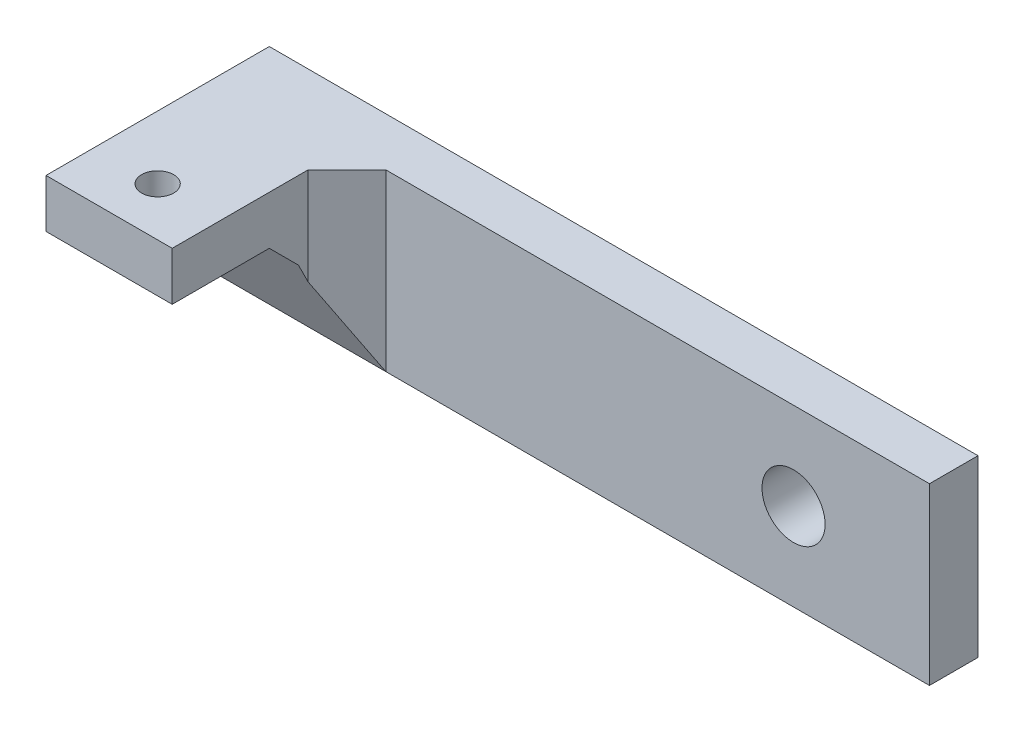
ISO-10303-21;
HEADER;
FILE_DESCRIPTION(('STEP AP214'),'2;1');
FILE_NAME('part.step','',(''),(''),'','','');
FILE_SCHEMA(('AUTOMOTIVE_DESIGN { 1 0 10303 214 1 1 1 1 }'));
ENDSEC;
DATA;
#1=APPLICATION_CONTEXT('core data for automotive mechanical design processes');
#2=APPLICATION_PROTOCOL_DEFINITION('international standard','automotive_design',2000,#1);
#3=PRODUCT_CONTEXT('',#1,'mechanical');
#4=PRODUCT('Part','Part','',(#3));
#5=PRODUCT_RELATED_PRODUCT_CATEGORY('part','',(#4));
#6=PRODUCT_DEFINITION_FORMATION('','',#4);
#7=PRODUCT_DEFINITION_CONTEXT('part definition',#1,'design');
#8=PRODUCT_DEFINITION('design','',#6,#7);
#9=PRODUCT_DEFINITION_SHAPE('','',#8);
#10=(LENGTH_UNIT() NAMED_UNIT(*) SI_UNIT(.MILLI.,.METRE.));
#11=(NAMED_UNIT(*) PLANE_ANGLE_UNIT() SI_UNIT($,.RADIAN.));
#12=(NAMED_UNIT(*) SI_UNIT($,.STERADIAN.) SOLID_ANGLE_UNIT());
#13=UNCERTAINTY_MEASURE_WITH_UNIT(LENGTH_MEASURE(1.E-05),#10,'distance_accuracy_value','');
#14=(GEOMETRIC_REPRESENTATION_CONTEXT(3) GLOBAL_UNCERTAINTY_ASSIGNED_CONTEXT((#13)) GLOBAL_UNIT_ASSIGNED_CONTEXT((#10,
#11,#12)) REPRESENTATION_CONTEXT('',''));
#15=CARTESIAN_POINT('',(0.,0.,0.));
#16=DIRECTION('',(0.,0.,1.));
#17=DIRECTION('',(1.,0.,0.));
#18=AXIS2_PLACEMENT_3D('',#15,#16,#17);
#19=CARTESIAN_POINT('',(0.,1.84930437196819,5.));
#20=DIRECTION('',(0.,1.,0.));
#21=DIRECTION('',(0.,0.,1.));
#22=AXIS2_PLACEMENT_3D('',#19,#20,#21);
#23=PLANE('',#22);
#24=DIRECTION('',(0.,0.,-1.));
#25=VECTOR('',#24,1.);
#26=CARTESIAN_POINT('',(-73.,1.84930437196819,27.2036033111745));
#27=LINE('',#26,#25);
#28=CARTESIAN_POINT('',(-73.,1.84930437196819,10.));
#29=VERTEX_POINT('',#28);
#30=CARTESIAN_POINT('',(-73.,1.8493043719682,5.));
#31=VERTEX_POINT('',#30);
#32=EDGE_CURVE('E123',#29,#31,#27,.T.);
#33=ORIENTED_EDGE('',*,*,#32,.T.);
#34=DIRECTION('',(1.,0.,0.));
#35=VECTOR('',#34,1.);
#36=CARTESIAN_POINT('',(0.,1.84930437196819,5.));
#37=LINE('',#36,#35);
#38=CARTESIAN_POINT('',(0.,1.84930437196819,5.));
#39=VERTEX_POINT('',#38);
#40=EDGE_CURVE('E108',#31,#39,#37,.T.);
#41=ORIENTED_EDGE('',*,*,#40,.T.);
#42=DIRECTION('',(0.,0.,-1.));
#43=VECTOR('',#42,1.);
#44=CARTESIAN_POINT('',(0.,1.84930437196819,5.));
#45=LINE('',#44,#43);
#46=CARTESIAN_POINT('',(0.,1.84930437196819,10.));
#47=VERTEX_POINT('',#46);
#48=EDGE_CURVE('E134',#47,#39,#45,.T.);
#49=ORIENTED_EDGE('',*,*,#48,.F.);
#50=DIRECTION('',(1.,0.,0.));
#51=VECTOR('',#50,1.);
#52=CARTESIAN_POINT('',(0.,1.84930437196819,10.));
#53=LINE('',#52,#51);
#54=CARTESIAN_POINT('',(-56.,1.84930437196819,10.));
#55=VERTEX_POINT('',#54);
#56=EDGE_CURVE('E137',#55,#47,#53,.T.);
#57=ORIENTED_EDGE('',*,*,#56,.F.);
#58=DIRECTION('',(-1.,0.,0.));
#59=VECTOR('',#58,1.);
#60=CARTESIAN_POINT('',(-50.,1.84930437196819,10.));
#61=LINE('',#60,#59);
#62=EDGE_CURVE('E131',#55,#29,#61,.T.);
#63=ORIENTED_EDGE('',*,*,#62,.T.);
#64=EDGE_LOOP('',(#33,#41,#49,#57,#63));
#65=FACE_BOUND('',#64,.T.);
#66=ADVANCED_FACE('F35',(#65),#23,.F.);
#67=CARTESIAN_POINT('',(-73.,19.8493043719682,27.2036033111745));
#68=DIRECTION('',(-1.,0.,0.));
#69=DIRECTION('',(0.,0.,1.));
#70=AXIS2_PLACEMENT_3D('',#67,#68,#69);
#71=PLANE('',#70);
#72=DIRECTION('',(0.,1.,0.));
#73=VECTOR('',#72,1.);
#74=CARTESIAN_POINT('',(-73.,19.8493043719682,5.));
#75=LINE('',#74,#73);
#76=CARTESIAN_POINT('',(-73.,19.8493043719682,5.));
#77=VERTEX_POINT('',#76);
#78=EDGE_CURVE('E51',#31,#77,#75,.T.);
#79=ORIENTED_EDGE('',*,*,#78,.F.);
#80=ORIENTED_EDGE('',*,*,#32,.F.);
#81=DIRECTION('',(0.,0.894427190999916,0.447213595499958));
#82=VECTOR('',#81,1.);
#83=CARTESIAN_POINT('',(-73.,11.8493043719682,15.));
#84=LINE('',#83,#82);
#85=CARTESIAN_POINT('',(-73.,11.8493043719682,15.));
#86=VERTEX_POINT('',#85);
#87=EDGE_CURVE('E116',#29,#86,#84,.T.);
#88=ORIENTED_EDGE('',*,*,#87,.T.);
#89=DIRECTION('',(0.,-0.707106781186543,-0.707106781186552));
#90=VECTOR('',#89,1.);
#91=CARTESIAN_POINT('',(-73.,11.8493043719682,15.));
#92=LINE('',#91,#90);
#93=CARTESIAN_POINT('',(-73.,14.8493043719682,18.));
#94=VERTEX_POINT('',#93);
#95=EDGE_CURVE('E148',#86,#94,#92,.F.);
#96=ORIENTED_EDGE('',*,*,#95,.T.);
#97=DIRECTION('',(0.,0.,-1.));
#98=VECTOR('',#97,1.);
#99=CARTESIAN_POINT('',(-73.,14.8493043719682,28.));
#100=LINE('',#99,#98);
#101=CARTESIAN_POINT('',(-73.,14.8493043719682,28.));
#102=VERTEX_POINT('',#101);
#103=EDGE_CURVE('E189',#102,#94,#100,.T.);
#104=ORIENTED_EDGE('',*,*,#103,.F.);
#105=DIRECTION('',(0.,-1.,0.));
#106=VECTOR('',#105,1.);
#107=CARTESIAN_POINT('',(-73.,19.8493043719682,28.));
#108=LINE('',#107,#106);
#109=CARTESIAN_POINT('',(-73.,19.8493043719682,28.));
#110=VERTEX_POINT('',#109);
#111=EDGE_CURVE('E181',#110,#102,#108,.T.);
#112=ORIENTED_EDGE('',*,*,#111,.F.);
#113=DIRECTION('',(0.,0.,-1.));
#114=VECTOR('',#113,1.);
#115=CARTESIAN_POINT('',(-73.,19.8493043719682,27.2036033111745));
#116=LINE('',#115,#114);
#117=EDGE_CURVE('E125',#110,#77,#116,.T.);
#118=ORIENTED_EDGE('',*,*,#117,.T.);
#119=EDGE_LOOP('',(#79,#80,#88,#96,#104,#112,#118));
#120=FACE_BOUND('',#119,.T.);
#121=ADVANCED_FACE('F121',(#120),#71,.T.);
#122=CARTESIAN_POINT('',(-60.,19.8493043719682,-17.2036033111745));
#123=DIRECTION('',(-1.,0.,0.));
#124=DIRECTION('',(0.,0.,1.));
#125=AXIS2_PLACEMENT_3D('',#122,#123,#124);
#126=PLANE('',#125);
#127=DIRECTION('',(0.,0.894427190999916,0.447213595499958));
#128=VECTOR('',#127,1.);
#129=CARTESIAN_POINT('',(-60.,5.36786304749839,11.7592793377651));
#130=LINE('',#129,#128);
#131=CARTESIAN_POINT('',(-60.,9.84930437196826,14.));
#132=VERTEX_POINT('',#131);
#133=CARTESIAN_POINT('',(-60.,11.8493043719682,15.));
#134=VERTEX_POINT('',#133);
#135=EDGE_CURVE('E173',#132,#134,#130,.T.);
#136=ORIENTED_EDGE('',*,*,#135,.F.);
#137=DIRECTION('',(0.,1.,0.));
#138=VECTOR('',#137,1.);
#139=CARTESIAN_POINT('',(-60.,19.8493043719682,14.));
#140=LINE('',#139,#138);
#141=CARTESIAN_POINT('',(-60.,19.8493043719682,14.));
#142=VERTEX_POINT('',#141);
#143=EDGE_CURVE('E59',#132,#142,#140,.T.);
#144=ORIENTED_EDGE('',*,*,#143,.T.);
#145=DIRECTION('',(0.,0.,1.));
#146=VECTOR('',#145,1.);
#147=CARTESIAN_POINT('',(-60.,19.8493043719682,-17.2036033111745));
#148=LINE('',#147,#146);
#149=CARTESIAN_POINT('',(-60.,19.8493043719682,28.));
#150=VERTEX_POINT('',#149);
#151=EDGE_CURVE('E162',#142,#150,#148,.T.);
#152=ORIENTED_EDGE('',*,*,#151,.T.);
#153=DIRECTION('',(0.,-1.,0.));
#154=VECTOR('',#153,1.);
#155=CARTESIAN_POINT('',(-60.,19.8493043719682,28.));
#156=LINE('',#155,#154);
#157=CARTESIAN_POINT('',(-60.,14.8493043719682,28.));
#158=VERTEX_POINT('',#157);
#159=EDGE_CURVE('E193',#150,#158,#156,.T.);
#160=ORIENTED_EDGE('',*,*,#159,.T.);
#161=DIRECTION('',(0.,0.,-1.));
#162=VECTOR('',#161,1.);
#163=CARTESIAN_POINT('',(-60.,14.8493043719682,28.));
#164=LINE('',#163,#162);
#165=CARTESIAN_POINT('',(-60.,14.8493043719682,18.));
#166=VERTEX_POINT('',#165);
#167=EDGE_CURVE('E192',#158,#166,#164,.T.);
#168=ORIENTED_EDGE('',*,*,#167,.T.);
#169=DIRECTION('',(0.,0.707106781186543,0.707106781186552));
#170=VECTOR('',#169,1.);
#171=CARTESIAN_POINT('',(-60.,-0.252497283619112,2.89819834441256));
#172=LINE('',#171,#170);
#173=EDGE_CURVE('E150',#166,#134,#172,.F.);
#174=ORIENTED_EDGE('',*,*,#173,.T.);
#175=EDGE_LOOP('',(#136,#144,#152,#160,#168,#174));
#176=FACE_BOUND('',#175,.T.);
#177=ADVANCED_FACE('F174',(#176),#126,.F.);
#178=CARTESIAN_POINT('',(-56.,0.,10.));
#179=DIRECTION('',(0.707106781186551,0.,0.707106781186544));
#180=DIRECTION('',(0.,1.,0.));
#181=AXIS2_PLACEMENT_3D('',#178,#179,#180);
#182=PLANE('',#181);
#183=DIRECTION('',(0.40824829046386,-0.816496580927727,-0.408248290463864));
#184=VECTOR('',#183,1.);
#185=CARTESIAN_POINT('',(-55.3835652093439,0.616434790656061,9.38356520934393));
#186=LINE('',#185,#184);
#187=EDGE_CURVE('E11',#55,#132,#186,.F.);
#188=ORIENTED_EDGE('',*,*,#187,.F.);
#189=DIRECTION('',(0.,-1.,0.));
#190=VECTOR('',#189,1.);
#191=CARTESIAN_POINT('',(-56.,1.84930437196819,10.));
#192=LINE('',#191,#190);
#193=CARTESIAN_POINT('',(-56.,19.8493043719682,10.));
#194=VERTEX_POINT('',#193);
#195=EDGE_CURVE('E153',#194,#55,#192,.T.);
#196=ORIENTED_EDGE('',*,*,#195,.F.);
#197=DIRECTION('',(-0.707106781186544,0.,0.707106781186551));
#198=VECTOR('',#197,1.);
#199=CARTESIAN_POINT('',(-25.5000000000003,19.8493043719682,-20.5));
#200=LINE('',#199,#198);
#201=EDGE_CURVE('E44',#142,#194,#200,.F.);
#202=ORIENTED_EDGE('',*,*,#201,.F.);
#203=ORIENTED_EDGE('',*,*,#143,.F.);
#204=EDGE_LOOP('',(#188,#196,#202,#203));
#205=FACE_BOUND('',#204,.T.);
#206=ADVANCED_FACE('F37',(#205),#182,.T.);
#207=CARTESIAN_POINT('',(0.,0.,5.));
#208=DIRECTION('',(-1.,0.,0.));
#209=DIRECTION('',(0.,0.,1.));
#210=AXIS2_PLACEMENT_3D('',#207,#208,#209);
#211=PLANE('',#210);
#212=ORIENTED_EDGE('',*,*,#48,.T.);
#213=DIRECTION('',(0.,1.,0.));
#214=VECTOR('',#213,1.);
#215=CARTESIAN_POINT('',(0.,0.,5.));
#216=LINE('',#215,#214);
#217=CARTESIAN_POINT('',(0.,19.8493043719682,5.));
#218=VERTEX_POINT('',#217);
#219=EDGE_CURVE('E111',#39,#218,#216,.T.);
#220=ORIENTED_EDGE('',*,*,#219,.T.);
#221=DIRECTION('',(0.,0.,-1.));
#222=VECTOR('',#221,1.);
#223=CARTESIAN_POINT('',(0.,19.8493043719682,5.));
#224=LINE('',#223,#222);
#225=CARTESIAN_POINT('',(0.,19.8493043719682,10.));
#226=VERTEX_POINT('',#225);
#227=EDGE_CURVE('E141',#226,#218,#224,.T.);
#228=ORIENTED_EDGE('',*,*,#227,.F.);
#229=DIRECTION('',(0.,1.,0.));
#230=VECTOR('',#229,1.);
#231=CARTESIAN_POINT('',(0.,0.,10.));
#232=LINE('',#231,#230);
#233=EDGE_CURVE('E169',#47,#226,#232,.T.);
#234=ORIENTED_EDGE('',*,*,#233,.F.);
#235=EDGE_LOOP('',(#212,#220,#228,#234));
#236=FACE_BOUND('',#235,.T.);
#237=ADVANCED_FACE('F204',(#236),#211,.F.);
#238=CARTESIAN_POINT('',(0.,19.8493043719682,5.));
#239=DIRECTION('',(0.,-1.,0.));
#240=DIRECTION('',(1.,0.,0.));
#241=AXIS2_PLACEMENT_3D('',#238,#239,#240);
#242=PLANE('',#241);
#243=CARTESIAN_POINT('',(-66.5,19.8493043719682,23.));
#244=DIRECTION('',(0.,-1.,0.));
#245=DIRECTION('',(1.,0.,0.));
#246=AXIS2_PLACEMENT_3D('',#243,#244,#245);
#247=CIRCLE('',#246,1.65);
#248=CARTESIAN_POINT('',(-66.5,19.8493043719682,21.35));
#249=VERTEX_POINT('',#248);
#250=EDGE_CURVE('E127',#249,#249,#247,.T.);
#251=ORIENTED_EDGE('',*,*,#250,.T.);
#252=EDGE_LOOP('',(#251));
#253=FACE_BOUND('',#252,.T.);
#254=ORIENTED_EDGE('',*,*,#227,.T.);
#255=DIRECTION('',(-1.,0.,0.));
#256=VECTOR('',#255,1.);
#257=CARTESIAN_POINT('',(17.,19.8493043719682,5.));
#258=LINE('',#257,#256);
#259=EDGE_CURVE('E126',#218,#77,#258,.T.);
#260=ORIENTED_EDGE('',*,*,#259,.T.);
#261=ORIENTED_EDGE('',*,*,#117,.F.);
#262=DIRECTION('',(-1.,0.,0.));
#263=VECTOR('',#262,1.);
#264=CARTESIAN_POINT('',(-46.0716117228159,19.8493043719682,28.));
#265=LINE('',#264,#263);
#266=EDGE_CURVE('E178',#150,#110,#265,.T.);
#267=ORIENTED_EDGE('',*,*,#266,.F.);
#268=ORIENTED_EDGE('',*,*,#151,.F.);
#269=ORIENTED_EDGE('',*,*,#201,.T.);
#270=DIRECTION('',(-1.,0.,0.));
#271=VECTOR('',#270,1.);
#272=CARTESIAN_POINT('',(0.,19.8493043719682,10.));
#273=LINE('',#272,#271);
#274=EDGE_CURVE('E132',#226,#194,#273,.T.);
#275=ORIENTED_EDGE('',*,*,#274,.F.);
#276=EDGE_LOOP('',(#254,#260,#261,#267,#268,#269,#275));
#277=FACE_BOUND('',#276,.T.);
#278=ADVANCED_FACE('F160',(#253,#277),#242,.F.);
#279=CARTESIAN_POINT('',(-14.,10.8493043719682,5.));
#280=DIRECTION('',(0.,0.,-1.));
#281=DIRECTION('',(-1.,0.,0.));
#282=AXIS2_PLACEMENT_3D('',#279,#280,#281);
#283=CYLINDRICAL_SURFACE('',#282,3.25);
#284=CARTESIAN_POINT('',(-14.,10.8493043719682,5.));
#285=DIRECTION('',(0.,0.,1.));
#286=DIRECTION('',(1.,0.,0.));
#287=AXIS2_PLACEMENT_3D('',#284,#285,#286);
#288=CIRCLE('',#287,3.25);
#289=CARTESIAN_POINT('',(-10.75,10.8493043719682,5.));
#290=VERTEX_POINT('',#289);
#291=EDGE_CURVE('E39',#290,#290,#288,.T.);
#292=ORIENTED_EDGE('',*,*,#291,.F.);
#293=EDGE_LOOP('',(#292));
#294=FACE_BOUND('',#293,.T.);
#295=CARTESIAN_POINT('',(-14.,10.8493043719682,10.));
#296=DIRECTION('',(0.,0.,1.));
#297=DIRECTION('',(1.,0.,0.));
#298=AXIS2_PLACEMENT_3D('',#295,#296,#297);
#299=CIRCLE('',#298,3.25);
#300=CARTESIAN_POINT('',(-10.75,10.8493043719682,10.));
#301=VERTEX_POINT('',#300);
#302=EDGE_CURVE('E199',#301,#301,#299,.T.);
#303=ORIENTED_EDGE('',*,*,#302,.T.);
#304=EDGE_LOOP('',(#303));
#305=FACE_BOUND('',#304,.T.);
#306=ADVANCED_FACE('F228',(#294,#305),#283,.F.);
#307=CARTESIAN_POINT('',(0.,0.,10.));
#308=DIRECTION('',(0.,0.,-1.));
#309=DIRECTION('',(1.,0.,0.));
#310=AXIS2_PLACEMENT_3D('',#307,#308,#309);
#311=PLANE('',#310);
#312=ORIENTED_EDGE('',*,*,#302,.F.);
#313=EDGE_LOOP('',(#312));
#314=FACE_BOUND('',#313,.T.);
#315=ORIENTED_EDGE('',*,*,#274,.T.);
#316=ORIENTED_EDGE('',*,*,#195,.T.);
#317=ORIENTED_EDGE('',*,*,#56,.T.);
#318=ORIENTED_EDGE('',*,*,#233,.T.);
#319=EDGE_LOOP('',(#315,#316,#317,#318));
#320=FACE_BOUND('',#319,.T.);
#321=ADVANCED_FACE('F167',(#314,#320),#311,.F.);
#322=CARTESIAN_POINT('',(-46.0716117228159,19.8493043719682,28.));
#323=DIRECTION('',(0.,0.,-1.));
#324=DIRECTION('',(-1.,0.,0.));
#325=AXIS2_PLACEMENT_3D('',#322,#323,#324);
#326=PLANE('',#325);
#327=ORIENTED_EDGE('',*,*,#159,.F.);
#328=ORIENTED_EDGE('',*,*,#266,.T.);
#329=ORIENTED_EDGE('',*,*,#111,.T.);
#330=DIRECTION('',(-1.,0.,0.));
#331=VECTOR('',#330,1.);
#332=CARTESIAN_POINT('',(-46.0716117228159,14.8493043719682,28.));
#333=LINE('',#332,#331);
#334=EDGE_CURVE('E188',#158,#102,#333,.T.);
#335=ORIENTED_EDGE('',*,*,#334,.F.);
#336=EDGE_LOOP('',(#327,#328,#329,#335));
#337=FACE_BOUND('',#336,.T.);
#338=ADVANCED_FACE('F219',(#337),#326,.F.);
#339=CARTESIAN_POINT('',(-46.0716117228159,14.8493043719682,28.));
#340=DIRECTION('',(0.,1.,0.));
#341=DIRECTION('',(0.,0.,1.));
#342=AXIS2_PLACEMENT_3D('',#339,#340,#341);
#343=PLANE('',#342);
#344=CARTESIAN_POINT('',(-66.5,14.8493043719682,23.));
#345=DIRECTION('',(0.,-1.,0.));
#346=DIRECTION('',(0.,0.,-1.));
#347=AXIS2_PLACEMENT_3D('',#344,#345,#346);
#348=CIRCLE('',#347,1.65);
#349=CARTESIAN_POINT('',(-66.5,14.8493043719682,21.35));
#350=VERTEX_POINT('',#349);
#351=EDGE_CURVE('E265',#350,#350,#348,.T.);
#352=ORIENTED_EDGE('',*,*,#351,.F.);
#353=EDGE_LOOP('',(#352));
#354=FACE_BOUND('',#353,.T.);
#355=ORIENTED_EDGE('',*,*,#103,.T.);
#356=DIRECTION('',(1.,0.,0.));
#357=VECTOR('',#356,1.);
#358=CARTESIAN_POINT('',(-60.,14.8493043719682,18.));
#359=LINE('',#358,#357);
#360=EDGE_CURVE('E146',#94,#166,#359,.T.);
#361=ORIENTED_EDGE('',*,*,#360,.T.);
#362=ORIENTED_EDGE('',*,*,#167,.F.);
#363=ORIENTED_EDGE('',*,*,#334,.T.);
#364=EDGE_LOOP('',(#355,#361,#362,#363));
#365=FACE_BOUND('',#364,.T.);
#366=ADVANCED_FACE('F216',(#354,#365),#343,.F.);
#367=CARTESIAN_POINT('',(0.,11.8493043719682,15.));
#368=DIRECTION('',(0.,-0.707106781186552,0.707106781186543));
#369=DIRECTION('',(1.,0.,0.));
#370=AXIS2_PLACEMENT_3D('',#367,#368,#369);
#371=PLANE('',#370);
#372=ORIENTED_EDGE('',*,*,#173,.F.);
#373=ORIENTED_EDGE('',*,*,#360,.F.);
#374=ORIENTED_EDGE('',*,*,#95,.F.);
#375=DIRECTION('',(-1.,0.,0.));
#376=VECTOR('',#375,1.);
#377=CARTESIAN_POINT('',(-73.,11.8493043719682,15.));
#378=LINE('',#377,#376);
#379=EDGE_CURVE('E144',#134,#86,#378,.T.);
#380=ORIENTED_EDGE('',*,*,#379,.F.);
#381=EDGE_LOOP('',(#372,#373,#374,#380));
#382=FACE_BOUND('',#381,.T.);
#383=ADVANCED_FACE('F213',(#382),#371,.T.);
#384=CARTESIAN_POINT('',(-50.,11.8493043719682,15.));
#385=DIRECTION('',(0.,-0.447213595499958,0.894427190999916));
#386=DIRECTION('',(0.,-0.894427190999916,-0.447213595499958));
#387=AXIS2_PLACEMENT_3D('',#384,#385,#386);
#388=PLANE('',#387);
#389=ORIENTED_EDGE('',*,*,#135,.T.);
#390=ORIENTED_EDGE('',*,*,#379,.T.);
#391=ORIENTED_EDGE('',*,*,#87,.F.);
#392=ORIENTED_EDGE('',*,*,#62,.F.);
#393=ORIENTED_EDGE('',*,*,#187,.T.);
#394=EDGE_LOOP('',(#389,#390,#391,#392,#393));
#395=FACE_BOUND('',#394,.T.);
#396=ADVANCED_FACE('F172',(#395),#388,.T.);
#397=CARTESIAN_POINT('',(17.,19.8493043719682,5.));
#398=DIRECTION('',(0.,0.,1.));
#399=DIRECTION('',(1.,0.,0.));
#400=AXIS2_PLACEMENT_3D('',#397,#398,#399);
#401=PLANE('',#400);
#402=ORIENTED_EDGE('',*,*,#291,.T.);
#403=EDGE_LOOP('',(#402));
#404=FACE_BOUND('',#403,.T.);
#405=ORIENTED_EDGE('',*,*,#78,.T.);
#406=ORIENTED_EDGE('',*,*,#259,.F.);
#407=ORIENTED_EDGE('',*,*,#219,.F.);
#408=ORIENTED_EDGE('',*,*,#40,.F.);
#409=EDGE_LOOP('',(#405,#406,#407,#408));
#410=FACE_BOUND('',#409,.T.);
#411=ADVANCED_FACE('F109',(#404,#410),#401,.F.);
#412=CARTESIAN_POINT('',(-66.5,104.849304371968,23.));
#413=DIRECTION('',(0.,-1.,0.));
#414=DIRECTION('',(0.,0.,-1.));
#415=AXIS2_PLACEMENT_3D('',#412,#413,#414);
#416=CYLINDRICAL_SURFACE('',#415,1.65);
#417=CARTESIAN_POINT('',(-66.5,14.8493043719682,21.35));
#418=CARTESIAN_POINT('',(-66.5,14.9013877053015,21.35));
#419=CARTESIAN_POINT('',(-66.5,14.9534710386349,21.35));
#420=CARTESIAN_POINT('',(-66.5,15.0576377053015,21.35));
#421=CARTESIAN_POINT('',(-66.5,15.1097210386348,21.35));
#422=CARTESIAN_POINT('',(-66.5,15.2138877053015,21.35));
#423=CARTESIAN_POINT('',(-66.5,15.2659710386349,21.35));
#424=CARTESIAN_POINT('',(-66.5,15.3701377053015,21.35));
#425=CARTESIAN_POINT('',(-66.5,15.4222210386349,21.35));
#426=CARTESIAN_POINT('',(-66.5,15.5263877053015,21.35));
#427=CARTESIAN_POINT('',(-66.5,15.5784710386349,21.35));
#428=CARTESIAN_POINT('',(-66.5,15.6826377053015,21.35));
#429=CARTESIAN_POINT('',(-66.5,15.7347210386349,21.35));
#430=CARTESIAN_POINT('',(-66.5,15.8388877053015,21.35));
#431=CARTESIAN_POINT('',(-66.5,15.8909710386349,21.35));
#432=CARTESIAN_POINT('',(-66.5,15.9951377053015,21.35));
#433=CARTESIAN_POINT('',(-66.5,16.0472210386349,21.35));
#434=CARTESIAN_POINT('',(-66.5,16.1513877053015,21.35));
#435=CARTESIAN_POINT('',(-66.5,16.2034710386349,21.35));
#436=CARTESIAN_POINT('',(-66.5,16.3076377053015,21.35));
#437=CARTESIAN_POINT('',(-66.5,16.3597210386348,21.35));
#438=CARTESIAN_POINT('',(-66.5,16.4638877053015,21.35));
#439=CARTESIAN_POINT('',(-66.5,16.5159710386349,21.35));
#440=CARTESIAN_POINT('',(-66.5,16.6201377053015,21.35));
#441=CARTESIAN_POINT('',(-66.5,16.6722210386349,21.35));
#442=CARTESIAN_POINT('',(-66.5,16.7763877053015,21.35));
#443=CARTESIAN_POINT('',(-66.5,16.8284710386349,21.35));
#444=CARTESIAN_POINT('',(-66.5,16.9326377053015,21.35));
#445=CARTESIAN_POINT('',(-66.5,16.9847210386349,21.35));
#446=CARTESIAN_POINT('',(-66.5,17.0888877053015,21.35));
#447=CARTESIAN_POINT('',(-66.5,17.1409710386349,21.35));
#448=CARTESIAN_POINT('',(-66.5,17.2451377053015,21.35));
#449=CARTESIAN_POINT('',(-66.5,17.2972210386349,21.35));
#450=CARTESIAN_POINT('',(-66.5,17.4013877053015,21.35));
#451=CARTESIAN_POINT('',(-66.5,17.4534710386349,21.35));
#452=CARTESIAN_POINT('',(-66.5,17.5576377053015,21.35));
#453=CARTESIAN_POINT('',(-66.5,17.6097210386349,21.35));
#454=CARTESIAN_POINT('',(-66.5,17.7138877053015,21.35));
#455=CARTESIAN_POINT('',(-66.5,17.7659710386349,21.35));
#456=CARTESIAN_POINT('',(-66.5,17.8701377053015,21.35));
#457=CARTESIAN_POINT('',(-66.5,17.9222210386349,21.35));
#458=CARTESIAN_POINT('',(-66.5,18.0263877053015,21.35));
#459=CARTESIAN_POINT('',(-66.5,18.0784710386349,21.35));
#460=CARTESIAN_POINT('',(-66.5,18.1826377053015,21.35));
#461=CARTESIAN_POINT('',(-66.5,18.2347210386349,21.35));
#462=CARTESIAN_POINT('',(-66.5,18.3388877053015,21.35));
#463=CARTESIAN_POINT('',(-66.5,18.3909710386349,21.35));
#464=CARTESIAN_POINT('',(-66.5,18.4951377053015,21.35));
#465=CARTESIAN_POINT('',(-66.5,18.5472210386349,21.35));
#466=CARTESIAN_POINT('',(-66.5,18.6513877053015,21.35));
#467=CARTESIAN_POINT('',(-66.5,18.7034710386349,21.35));
#468=CARTESIAN_POINT('',(-66.5,18.8076377053015,21.35));
#469=CARTESIAN_POINT('',(-66.5,18.8597210386349,21.35));
#470=CARTESIAN_POINT('',(-66.5,18.9638877053015,21.35));
#471=CARTESIAN_POINT('',(-66.5,19.0159710386349,21.35));
#472=CARTESIAN_POINT('',(-66.5,19.1201377053015,21.35));
#473=CARTESIAN_POINT('',(-66.5,19.1722210386349,21.35));
#474=CARTESIAN_POINT('',(-66.5,19.2763877053015,21.35));
#475=CARTESIAN_POINT('',(-66.5,19.3284710386349,21.35));
#476=CARTESIAN_POINT('',(-66.5,19.4326377053015,21.35));
#477=CARTESIAN_POINT('',(-66.5,19.4847210386349,21.35));
#478=CARTESIAN_POINT('',(-66.5,19.5888877053015,21.35));
#479=CARTESIAN_POINT('',(-66.5,19.6409710386349,21.35));
#480=CARTESIAN_POINT('',(-66.5,19.7451377053015,21.35));
#481=CARTESIAN_POINT('',(-66.5,19.7972210386349,21.35));
#482=CARTESIAN_POINT('',(-66.5,19.8493043719682,21.35));
#483=B_SPLINE_CURVE_WITH_KNOTS('',3,(#417,#418,#419,#420,#421,#422,#423,#424,#425,#426,#427,
#428,#429,#430,#431,#432,#433,#434,#435,#436,#437,#438,#439,#440,#441,#442,#443,#444,#445,#446,
#447,#448,#449,#450,#451,#452,#453,#454,#455,#456,#457,#458,#459,#460,#461,#462,#463,#464,#465,
#466,#467,#468,#469,#470,#471,#472,#473,#474,#475,#476,#477,#478,#479,#480,#481,#482),
.UNSPECIFIED.,.F.,.F.,(4,2,2,2,2,2,2,2,2,2,2,2,2,2,2,2,2,2,2,2,2,2,2,2,2,2,2,2,2,2,2,2,4),(0.,
0.156249999999997,0.312499999999993,0.468750000000004,0.625000000000001,0.781249999999997,
0.937500000000008,1.09375,1.25,1.40625,1.56249999999999,1.71875,1.875,2.03125,2.18750000000001,
2.34375000000001,2.5,2.65625,2.8125,2.96875000000001,3.125,3.28125,3.43750000000001,
3.59375000000001,3.75,3.90625,4.0625,4.21875000000001,4.375,4.53125,4.68750000000001,
4.84375000000001,5.),.UNSPECIFIED.);
#484=EDGE_CURVE('BSEAM254',#350,#249,#483,.T.);
#485=ORIENTED_EDGE('',*,*,#351,.T.);
#486=ORIENTED_EDGE('',*,*,#250,.F.);
#487=ORIENTED_EDGE('',*,*,#484,.T.);
#488=ORIENTED_EDGE('',*,*,#484,.F.);
#489=EDGE_LOOP('',(#485,#487,#486,#488));
#490=FACE_BOUND('',#489,.T.);
#491=ADVANCED_FACE('F254',(#490),#416,.F.);
#492=CLOSED_SHELL('',(#66,#121,#177,#206,#237,#278,#306,#321,#338,#366,#383,#396,#411,#491));
#493=MANIFOLD_SOLID_BREP('B2',#492);
#494=ADVANCED_BREP_SHAPE_REPRESENTATION('',(#18,#493),#14);
#495=SHAPE_DEFINITION_REPRESENTATION(#9,#494);
ENDSEC;
END-ISO-10303-21;
